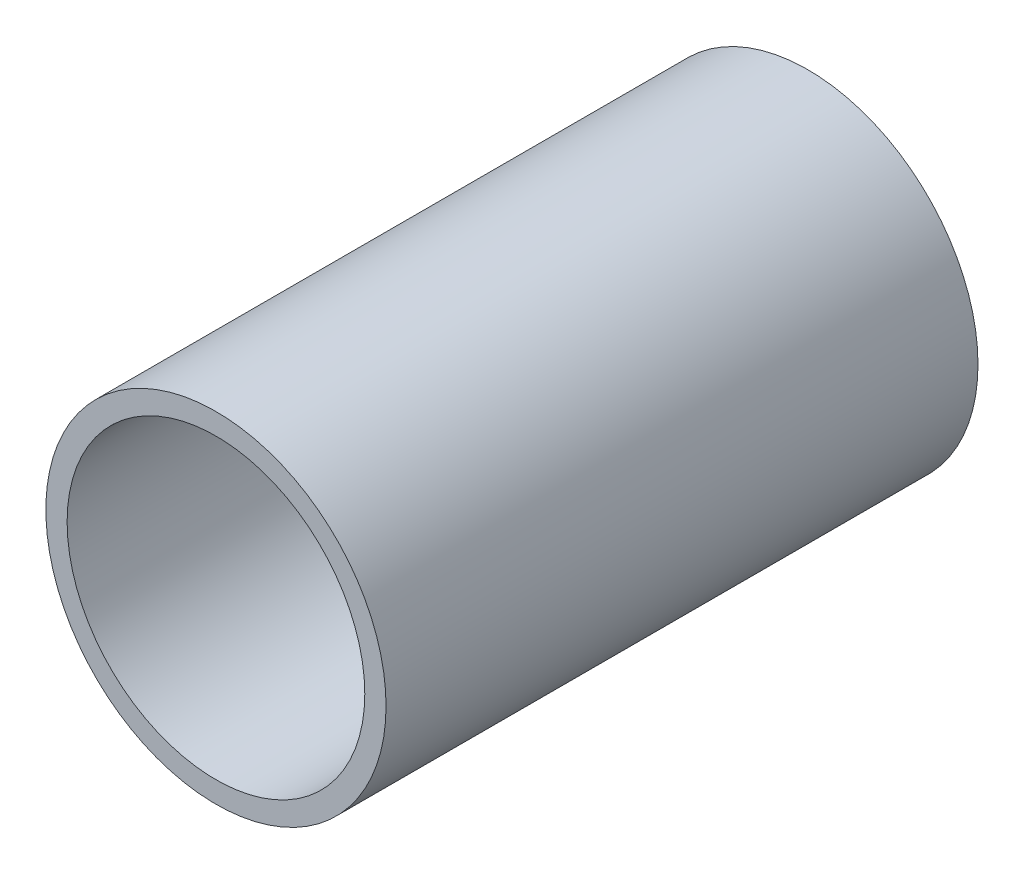
ISO-10303-21;
HEADER;
FILE_DESCRIPTION(('STEP AP214'),'2;1');
FILE_NAME('part.step','',(''),(''),'','','');
FILE_SCHEMA(('AUTOMOTIVE_DESIGN { 1 0 10303 214 1 1 1 1 }'));
ENDSEC;
DATA;
#1=APPLICATION_CONTEXT('core data for automotive mechanical design processes');
#2=APPLICATION_PROTOCOL_DEFINITION('international standard','automotive_design',2000,#1);
#3=PRODUCT_CONTEXT('',#1,'mechanical');
#4=PRODUCT('Part','Part','',(#3));
#5=PRODUCT_RELATED_PRODUCT_CATEGORY('part','',(#4));
#6=PRODUCT_DEFINITION_FORMATION('','',#4);
#7=PRODUCT_DEFINITION_CONTEXT('part definition',#1,'design');
#8=PRODUCT_DEFINITION('design','',#6,#7);
#9=PRODUCT_DEFINITION_SHAPE('','',#8);
#10=(LENGTH_UNIT() NAMED_UNIT(*) SI_UNIT(.MILLI.,.METRE.));
#11=(NAMED_UNIT(*) PLANE_ANGLE_UNIT() SI_UNIT($,.RADIAN.));
#12=(NAMED_UNIT(*) SI_UNIT($,.STERADIAN.) SOLID_ANGLE_UNIT());
#13=UNCERTAINTY_MEASURE_WITH_UNIT(LENGTH_MEASURE(1.E-05),#10,'distance_accuracy_value','');
#14=(GEOMETRIC_REPRESENTATION_CONTEXT(3) GLOBAL_UNCERTAINTY_ASSIGNED_CONTEXT((#13)) GLOBAL_UNIT_ASSIGNED_CONTEXT((#10,
#11,#12)) REPRESENTATION_CONTEXT('',''));
#15=CARTESIAN_POINT('',(0.,0.,0.));
#16=DIRECTION('',(0.,0.,1.));
#17=DIRECTION('',(1.,0.,0.));
#18=AXIS2_PLACEMENT_3D('',#15,#16,#17);
#19=CARTESIAN_POINT('',(0.,0.,44.196));
#20=DIRECTION('',(0.,0.,1.));
#21=DIRECTION('',(1.,0.,0.));
#22=AXIS2_PLACEMENT_3D('',#19,#20,#21);
#23=PLANE('',#22);
#24=CARTESIAN_POINT('',(0.,0.,44.196));
#25=DIRECTION('',(0.,0.,1.));
#26=DIRECTION('',(1.,0.,0.));
#27=AXIS2_PLACEMENT_3D('',#24,#25,#26);
#28=CIRCLE('',#27,12.7);
#29=CARTESIAN_POINT('',(12.7,0.,44.196));
#30=VERTEX_POINT('',#29);
#31=EDGE_CURVE('E10',#30,#30,#28,.T.);
#32=ORIENTED_EDGE('',*,*,#31,.T.);
#33=EDGE_LOOP('',(#32));
#34=FACE_BOUND('',#33,.T.);
#35=CARTESIAN_POINT('',(0.,0.,44.196));
#36=DIRECTION('',(0.,0.,1.));
#37=DIRECTION('',(1.,0.,0.));
#38=AXIS2_PLACEMENT_3D('',#35,#36,#37);
#39=CIRCLE('',#38,11.1125);
#40=CARTESIAN_POINT('',(11.1125,0.,44.196));
#41=VERTEX_POINT('',#40);
#42=EDGE_CURVE('E56',#41,#41,#39,.T.);
#43=ORIENTED_EDGE('',*,*,#42,.F.);
#44=EDGE_LOOP('',(#43));
#45=FACE_BOUND('',#44,.T.);
#46=ADVANCED_FACE('F43',(#34,#45),#23,.T.);
#47=CARTESIAN_POINT('',(0.,0.,0.));
#48=DIRECTION('',(0.,0.,1.));
#49=DIRECTION('',(1.,0.,0.));
#50=AXIS2_PLACEMENT_3D('',#47,#48,#49);
#51=PLANE('',#50);
#52=CARTESIAN_POINT('',(0.,0.,0.));
#53=DIRECTION('',(0.,0.,1.));
#54=DIRECTION('',(1.,0.,0.));
#55=AXIS2_PLACEMENT_3D('',#52,#53,#54);
#56=CIRCLE('',#55,12.7);
#57=CARTESIAN_POINT('',(12.7,0.,0.));
#58=VERTEX_POINT('',#57);
#59=EDGE_CURVE('E47',#58,#58,#56,.T.);
#60=ORIENTED_EDGE('',*,*,#59,.F.);
#61=EDGE_LOOP('',(#60));
#62=FACE_BOUND('',#61,.T.);
#63=CARTESIAN_POINT('',(0.,0.,0.));
#64=DIRECTION('',(0.,0.,1.));
#65=DIRECTION('',(1.,0.,0.));
#66=AXIS2_PLACEMENT_3D('',#63,#64,#65);
#67=CIRCLE('',#66,11.1125);
#68=CARTESIAN_POINT('',(11.1125,0.,0.));
#69=VERTEX_POINT('',#68);
#70=EDGE_CURVE('E58',#69,#69,#67,.T.);
#71=ORIENTED_EDGE('',*,*,#70,.T.);
#72=EDGE_LOOP('',(#71));
#73=FACE_BOUND('',#72,.T.);
#74=ADVANCED_FACE('F70',(#62,#73),#51,.F.);
#75=CARTESIAN_POINT('',(0.,0.,44.196));
#76=DIRECTION('',(0.,0.,-1.));
#77=DIRECTION('',(-1.,0.,0.));
#78=AXIS2_PLACEMENT_3D('',#75,#76,#77);
#79=CYLINDRICAL_SURFACE('',#78,12.7);
#80=ORIENTED_EDGE('',*,*,#31,.F.);
#81=EDGE_LOOP('',(#80));
#82=FACE_BOUND('',#81,.T.);
#83=ORIENTED_EDGE('',*,*,#59,.T.);
#84=EDGE_LOOP('',(#83));
#85=FACE_BOUND('',#84,.T.);
#86=ADVANCED_FACE('F45',(#82,#85),#79,.T.);
#87=CARTESIAN_POINT('',(0.,0.,44.196));
#88=DIRECTION('',(0.,0.,-1.));
#89=DIRECTION('',(-1.,0.,0.));
#90=AXIS2_PLACEMENT_3D('',#87,#88,#89);
#91=CYLINDRICAL_SURFACE('',#90,11.1125);
#92=ORIENTED_EDGE('',*,*,#42,.T.);
#93=EDGE_LOOP('',(#92));
#94=FACE_BOUND('',#93,.T.);
#95=ORIENTED_EDGE('',*,*,#70,.F.);
#96=EDGE_LOOP('',(#95));
#97=FACE_BOUND('',#96,.T.);
#98=ADVANCED_FACE('F66',(#94,#97),#91,.F.);
#99=CLOSED_SHELL('',(#46,#74,#86,#98));
#100=MANIFOLD_SOLID_BREP('B2',#99);
#101=ADVANCED_BREP_SHAPE_REPRESENTATION('',(#18,#100),#14);
#102=SHAPE_DEFINITION_REPRESENTATION(#9,#101);
ENDSEC;
END-ISO-10303-21;
